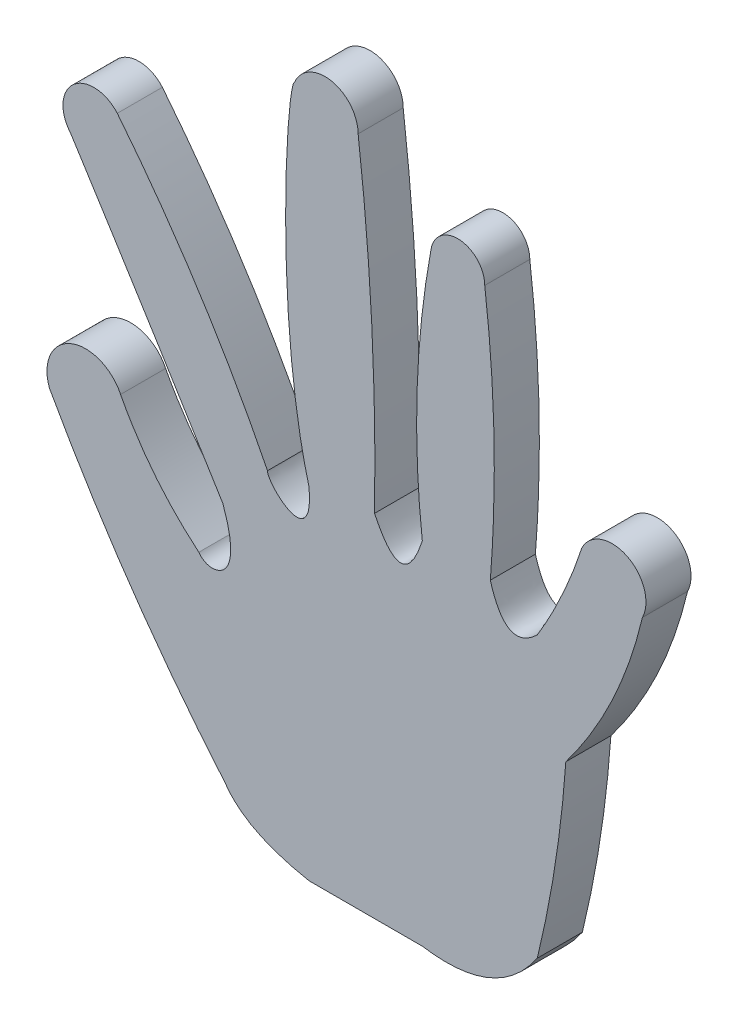
ISO-10303-21;
HEADER;
FILE_DESCRIPTION(('STEP AP214'),'2;1');
FILE_NAME('part.step','',(''),(''),'','','');
FILE_SCHEMA(('AUTOMOTIVE_DESIGN { 1 0 10303 214 1 1 1 1 }'));
ENDSEC;
DATA;
#1=APPLICATION_CONTEXT('core data for automotive mechanical design processes');
#2=APPLICATION_PROTOCOL_DEFINITION('international standard','automotive_design',2000,#1);
#3=PRODUCT_CONTEXT('',#1,'mechanical');
#4=PRODUCT('Part','Part','',(#3));
#5=PRODUCT_RELATED_PRODUCT_CATEGORY('part','',(#4));
#6=PRODUCT_DEFINITION_FORMATION('','',#4);
#7=PRODUCT_DEFINITION_CONTEXT('part definition',#1,'design');
#8=PRODUCT_DEFINITION('design','',#6,#7);
#9=PRODUCT_DEFINITION_SHAPE('','',#8);
#10=(LENGTH_UNIT() NAMED_UNIT(*) SI_UNIT(.MILLI.,.METRE.));
#11=(NAMED_UNIT(*) PLANE_ANGLE_UNIT() SI_UNIT($,.RADIAN.));
#12=(NAMED_UNIT(*) SI_UNIT($,.STERADIAN.) SOLID_ANGLE_UNIT());
#13=UNCERTAINTY_MEASURE_WITH_UNIT(LENGTH_MEASURE(1.E-05),#10,'distance_accuracy_value','');
#14=(GEOMETRIC_REPRESENTATION_CONTEXT(3) GLOBAL_UNCERTAINTY_ASSIGNED_CONTEXT((#13)) GLOBAL_UNIT_ASSIGNED_CONTEXT((#10,
#11,#12)) REPRESENTATION_CONTEXT('',''));
#15=CARTESIAN_POINT('',(0.,0.,0.));
#16=DIRECTION('',(0.,0.,1.));
#17=DIRECTION('',(1.,0.,0.));
#18=AXIS2_PLACEMENT_3D('',#15,#16,#17);
#19=CARTESIAN_POINT('',(2230.70337672121,-7786.81505543782,1000.));
#20=CARTESIAN_POINT('',(838.877081490708,-7523.15990356654,1000.));
#21=CARTESIAN_POINT('',(379.879561729541,-6850.52605220118,1000.));
#22=B_SPLINE_CURVE_WITH_KNOTS('',2,(#19,#20,#21),.UNSPECIFIED.,.F.,.F.,(3,3),(0.,1.),.UNSPECIFIED.);
#23=DIRECTION('',(0.,0.,-1.));
#24=VECTOR('',#23,1.);
#25=SURFACE_OF_LINEAR_EXTRUSION('',#22,#24);
#26=CARTESIAN_POINT('',(2230.70337672121,-7786.81505543782,0.));
#27=CARTESIAN_POINT('',(838.877081490708,-7523.15990356654,0.));
#28=CARTESIAN_POINT('',(379.879561729541,-6850.52605220118,0.));
#29=B_SPLINE_CURVE_WITH_KNOTS('',2,(#26,#27,#28),.UNSPECIFIED.,.F.,.F.,(3,3),(0.,1.),.UNSPECIFIED.);
#30=CARTESIAN_POINT('',(2230.70337672121,-7786.81505543782,0.));
#31=VERTEX_POINT('',#30);
#32=CARTESIAN_POINT('',(395.792572054723,-6873.32998539171,0.));
#33=VERTEX_POINT('',#32);
#34=EDGE_CURVE('E381',#31,#33,#29,.T.);
#35=ORIENTED_EDGE('',*,*,#34,.F.);
#36=DIRECTION('',(0.,0.,-1.));
#37=VECTOR('',#36,1.);
#38=CARTESIAN_POINT('',(2230.70337672121,-7786.81505543782,1000.));
#39=LINE('',#38,#37);
#40=CARTESIAN_POINT('',(2230.70337672121,-7786.81505543782,1000.));
#41=VERTEX_POINT('',#40);
#42=EDGE_CURVE('E11',#41,#31,#39,.T.);
#43=ORIENTED_EDGE('',*,*,#42,.F.);
#44=CARTESIAN_POINT('',(395.792572054723,-6873.32998539171,1000.));
#45=VERTEX_POINT('',#44);
#46=EDGE_CURVE('E543',#41,#45,#22,.T.);
#47=ORIENTED_EDGE('',*,*,#46,.T.);
#48=DIRECTION('',(0.,0.,-1.));
#49=VECTOR('',#48,1.);
#50=CARTESIAN_POINT('',(395.792572054723,-6873.32998539171,1000.));
#51=LINE('',#50,#49);
#52=EDGE_CURVE('E142',#45,#33,#51,.T.);
#53=ORIENTED_EDGE('',*,*,#52,.T.);
#54=EDGE_LOOP('',(#35,#43,#47,#53));
#55=FACE_BOUND('',#54,.T.);
#56=ADVANCED_FACE('F39',(#55),#25,.T.);
#57=CARTESIAN_POINT('',(0.,-7786.81505543782,1000.));
#58=DIRECTION('',(0.,1.,0.));
#59=DIRECTION('',(0.,0.,1.));
#60=AXIS2_PLACEMENT_3D('',#57,#58,#59);
#61=PLANE('',#60);
#62=DIRECTION('',(1.,0.,0.));
#63=VECTOR('',#62,1.);
#64=CARTESIAN_POINT('',(0.,-7786.81505543782,0.));
#65=LINE('',#64,#63);
#66=CARTESIAN_POINT('',(4743.05383111336,-7786.81505543782,0.));
#67=VERTEX_POINT('',#66);
#68=EDGE_CURVE('E376',#31,#67,#65,.T.);
#69=ORIENTED_EDGE('',*,*,#68,.T.);
#70=DIRECTION('',(0.,0.,-1.));
#71=VECTOR('',#70,1.);
#72=CARTESIAN_POINT('',(4743.05383111336,-7786.81505543782,1000.));
#73=LINE('',#72,#71);
#74=CARTESIAN_POINT('',(4743.05383111336,-7786.81505543782,1000.));
#75=VERTEX_POINT('',#74);
#76=EDGE_CURVE('E49',#75,#67,#73,.T.);
#77=ORIENTED_EDGE('',*,*,#76,.F.);
#78=DIRECTION('',(1.,0.,0.));
#79=VECTOR('',#78,1.);
#80=CARTESIAN_POINT('',(0.,-7786.81505543782,1000.));
#81=LINE('',#80,#79);
#82=EDGE_CURVE('E553',#41,#75,#81,.T.);
#83=ORIENTED_EDGE('',*,*,#82,.F.);
#84=ORIENTED_EDGE('',*,*,#42,.T.);
#85=EDGE_LOOP('',(#69,#77,#83,#84));
#86=FACE_BOUND('',#85,.T.);
#87=ADVANCED_FACE('F377',(#86),#61,.F.);
#88=CARTESIAN_POINT('',(7294.05771337584,-6741.7726687625,1000.));
#89=CARTESIAN_POINT('',(6406.51771806842,-8048.24499738228,1000.));
#90=CARTESIAN_POINT('',(4743.05383111336,-7786.81505543782,1000.));
#91=B_SPLINE_CURVE_WITH_KNOTS('',2,(#88,#89,#90),.UNSPECIFIED.,.F.,.F.,(3,3),(0.,1.),.UNSPECIFIED.);
#92=DIRECTION('',(0.,0.,-1.));
#93=VECTOR('',#92,1.);
#94=SURFACE_OF_LINEAR_EXTRUSION('',#91,#93);
#95=CARTESIAN_POINT('',(7294.05771337584,-6741.7726687625,0.));
#96=CARTESIAN_POINT('',(6406.51771806842,-8048.24499738228,0.));
#97=CARTESIAN_POINT('',(4743.05383111336,-7786.81505543782,0.));
#98=B_SPLINE_CURVE_WITH_KNOTS('',2,(#95,#96,#97),.UNSPECIFIED.,.F.,.F.,(3,3),(0.,1.),.UNSPECIFIED.);
#99=CARTESIAN_POINT('',(7294.05771337584,-6741.7726687625,0.));
#100=VERTEX_POINT('',#99);
#101=EDGE_CURVE('E370',#100,#67,#98,.T.);
#102=ORIENTED_EDGE('',*,*,#101,.F.);
#103=DIRECTION('',(0.,0.,-1.));
#104=VECTOR('',#103,1.);
#105=CARTESIAN_POINT('',(7294.05771337584,-6741.7726687625,1000.));
#106=LINE('',#105,#104);
#107=CARTESIAN_POINT('',(7294.05771337584,-6741.7726687625,1000.));
#108=VERTEX_POINT('',#107);
#109=EDGE_CURVE('E360',#108,#100,#106,.T.);
#110=ORIENTED_EDGE('',*,*,#109,.F.);
#111=EDGE_CURVE('E373',#108,#75,#91,.T.);
#112=ORIENTED_EDGE('',*,*,#111,.T.);
#113=ORIENTED_EDGE('',*,*,#76,.T.);
#114=EDGE_LOOP('',(#102,#110,#112,#113));
#115=FACE_BOUND('',#114,.T.);
#116=ADVANCED_FACE('F368',(#115),#94,.T.);
#117=CARTESIAN_POINT('',(7926.4035184112,-2651.00344321377,1000.));
#118=CARTESIAN_POINT('',(7782.90997558239,-4725.08830100852,1000.));
#119=CARTESIAN_POINT('',(7294.05771337584,-6741.7726687625,1000.));
#120=B_SPLINE_CURVE_WITH_KNOTS('',2,(#117,#118,#119),.UNSPECIFIED.,.F.,.F.,(3,3),(0.,1.),.UNSPECIFIED.);
#121=DIRECTION('',(0.,0.,-1.));
#122=VECTOR('',#121,1.);
#123=SURFACE_OF_LINEAR_EXTRUSION('',#120,#122);
#124=CARTESIAN_POINT('',(7926.4035184112,-2651.00344321377,0.));
#125=CARTESIAN_POINT('',(7782.90997558239,-4725.08830100852,0.));
#126=CARTESIAN_POINT('',(7294.05771337584,-6741.7726687625,0.));
#127=B_SPLINE_CURVE_WITH_KNOTS('',2,(#124,#125,#126),.UNSPECIFIED.,.F.,.F.,(3,3),(0.,1.),.UNSPECIFIED.);
#128=CARTESIAN_POINT('',(7926.4035184112,-2651.00344321377,0.));
#129=VERTEX_POINT('',#128);
#130=EDGE_CURVE('E386',#129,#100,#127,.T.);
#131=ORIENTED_EDGE('',*,*,#130,.F.);
#132=DIRECTION('',(0.,0.,-1.));
#133=VECTOR('',#132,1.);
#134=CARTESIAN_POINT('',(7926.4035184112,-2651.00344321377,1000.));
#135=LINE('',#134,#133);
#136=CARTESIAN_POINT('',(7926.4035184112,-2651.00344321377,1000.));
#137=VERTEX_POINT('',#136);
#138=EDGE_CURVE('E357',#137,#129,#135,.T.);
#139=ORIENTED_EDGE('',*,*,#138,.F.);
#140=EDGE_CURVE('E568',#137,#108,#120,.T.);
#141=ORIENTED_EDGE('',*,*,#140,.T.);
#142=ORIENTED_EDGE('',*,*,#109,.T.);
#143=EDGE_LOOP('',(#131,#139,#141,#142));
#144=FACE_BOUND('',#143,.T.);
#145=ADVANCED_FACE('F579',(#144),#123,.T.);
#146=CARTESIAN_POINT('',(9626.32112904252,970.777177927694,1000.));
#147=CARTESIAN_POINT('',(9151.24781503962,-1031.31597078158,1000.));
#148=CARTESIAN_POINT('',(7926.4035184112,-2651.00344321377,1000.));
#149=B_SPLINE_CURVE_WITH_KNOTS('',2,(#146,#147,#148),.UNSPECIFIED.,.F.,.F.,(3,3),(0.,1.),.UNSPECIFIED.);
#150=DIRECTION('',(0.,0.,-1.));
#151=VECTOR('',#150,1.);
#152=SURFACE_OF_LINEAR_EXTRUSION('',#149,#151);
#153=CARTESIAN_POINT('',(9626.32112904252,970.777177927694,0.));
#154=CARTESIAN_POINT('',(9151.24781503962,-1031.31597078158,0.));
#155=CARTESIAN_POINT('',(7926.4035184112,-2651.00344321377,0.));
#156=B_SPLINE_CURVE_WITH_KNOTS('',2,(#153,#154,#155),.UNSPECIFIED.,.F.,.F.,(3,3),(0.,1.),.UNSPECIFIED.);
#157=CARTESIAN_POINT('',(9626.32112904252,970.777177927694,0.));
#158=VERTEX_POINT('',#157);
#159=EDGE_CURVE('E390',#158,#129,#156,.T.);
#160=ORIENTED_EDGE('',*,*,#159,.F.);
#161=DIRECTION('',(0.,0.,-1.));
#162=VECTOR('',#161,1.);
#163=CARTESIAN_POINT('',(9626.32112904252,970.777177927694,1000.));
#164=LINE('',#163,#162);
#165=CARTESIAN_POINT('',(9626.32112904252,970.777177927694,1000.));
#166=VERTEX_POINT('',#165);
#167=EDGE_CURVE('E354',#166,#158,#164,.T.);
#168=ORIENTED_EDGE('',*,*,#167,.F.);
#169=EDGE_CURVE('E860',#166,#137,#149,.T.);
#170=ORIENTED_EDGE('',*,*,#169,.T.);
#171=ORIENTED_EDGE('',*,*,#138,.T.);
#172=EDGE_LOOP('',(#160,#168,#170,#171));
#173=FACE_BOUND('',#172,.T.);
#174=ADVANCED_FACE('F606',(#173),#152,.T.);
#175=CARTESIAN_POINT('',(8954.80678660998,1304.79587187668,1000.));
#176=DIRECTION('',(0.,0.,-1.));
#177=DIRECTION('',(-1.,0.,0.));
#178=AXIS2_PLACEMENT_3D('',#175,#176,#177);
#179=CYLINDRICAL_SURFACE('',#178,750.);
#180=CARTESIAN_POINT('',(8954.80678660998,1304.79587187668,0.));
#181=DIRECTION('',(0.,0.,1.));
#182=DIRECTION('',(1.,0.,0.));
#183=AXIS2_PLACEMENT_3D('',#180,#181,#182);
#184=CIRCLE('',#183,750.);
#185=CARTESIAN_POINT('',(8283.29244417744,1638.81456582568,0.));
#186=VERTEX_POINT('',#185);
#187=EDGE_CURVE('E407',#186,#158,#184,.F.);
#188=ORIENTED_EDGE('',*,*,#187,.F.);
#189=DIRECTION('',(0.,0.,-1.));
#190=VECTOR('',#189,1.);
#191=CARTESIAN_POINT('',(8283.29244417744,1638.81456582568,1000.));
#192=LINE('',#191,#190);
#193=CARTESIAN_POINT('',(8283.29244417744,1638.81456582568,1000.));
#194=VERTEX_POINT('',#193);
#195=EDGE_CURVE('E351',#194,#186,#192,.T.);
#196=ORIENTED_EDGE('',*,*,#195,.F.);
#197=CARTESIAN_POINT('',(8954.80678660998,1304.79587187668,1000.));
#198=DIRECTION('',(0.,0.,1.));
#199=DIRECTION('',(1.,0.,0.));
#200=AXIS2_PLACEMENT_3D('',#197,#198,#199);
#201=CIRCLE('',#200,750.);
#202=EDGE_CURVE('E857',#194,#166,#201,.F.);
#203=ORIENTED_EDGE('',*,*,#202,.T.);
#204=ORIENTED_EDGE('',*,*,#167,.T.);
#205=EDGE_LOOP('',(#188,#196,#203,#204));
#206=FACE_BOUND('',#205,.T.);
#207=ADVANCED_FACE('F615',(#206),#179,.T.);
#208=CARTESIAN_POINT('',(8283.29244417744,1638.81456582568,1000.));
#209=CARTESIAN_POINT('',(7913.68165515547,496.999655054849,1000.));
#210=CARTESIAN_POINT('',(7292.14911922608,-532.552706312509,1000.));
#211=B_SPLINE_CURVE_WITH_KNOTS('',2,(#208,#209,#210),.UNSPECIFIED.,.F.,.F.,(3,3),(0.,1.),.UNSPECIFIED.);
#212=DIRECTION('',(0.,0.,-1.));
#213=VECTOR('',#212,1.);
#214=SURFACE_OF_LINEAR_EXTRUSION('',#211,#213);
#215=CARTESIAN_POINT('',(8283.29244417744,1638.81456582568,0.));
#216=CARTESIAN_POINT('',(7913.68165515547,496.999655054849,0.));
#217=CARTESIAN_POINT('',(7292.14911922608,-532.552706312509,0.));
#218=B_SPLINE_CURVE_WITH_KNOTS('',2,(#215,#216,#217),.UNSPECIFIED.,.F.,.F.,(3,3),(0.,1.),.UNSPECIFIED.);
#219=CARTESIAN_POINT('',(7292.14911922608,-532.552706312509,0.));
#220=VERTEX_POINT('',#219);
#221=EDGE_CURVE('E414',#186,#220,#218,.T.);
#222=ORIENTED_EDGE('',*,*,#221,.T.);
#223=DIRECTION('',(0.,0.,-1.));
#224=VECTOR('',#223,1.);
#225=CARTESIAN_POINT('',(7292.14911922608,-532.552706312509,1000.));
#226=LINE('',#225,#224);
#227=CARTESIAN_POINT('',(7292.14911922608,-532.552706312509,1000.));
#228=VERTEX_POINT('',#227);
#229=EDGE_CURVE('E347',#228,#220,#226,.T.);
#230=ORIENTED_EDGE('',*,*,#229,.F.);
#231=EDGE_CURVE('E852',#194,#228,#211,.T.);
#232=ORIENTED_EDGE('',*,*,#231,.F.);
#233=ORIENTED_EDGE('',*,*,#195,.T.);
#234=EDGE_LOOP('',(#222,#230,#232,#233));
#235=FACE_BOUND('',#234,.T.);
#236=ADVANCED_FACE('F624',(#235),#214,.F.);
#237=CARTESIAN_POINT('',(7292.14911922608,-532.552706312509,1000.));
#238=CARTESIAN_POINT('',(6599.09596299458,-1196.63110017982,1000.));
#239=CARTESIAN_POINT('',(6251.69457875293,0.,1000.));
#240=B_SPLINE_CURVE_WITH_KNOTS('',2,(#237,#238,#239),.UNSPECIFIED.,.F.,.F.,(3,3),(0.,1.),.UNSPECIFIED.);
#241=DIRECTION('',(0.,0.,-1.));
#242=VECTOR('',#241,1.);
#243=SURFACE_OF_LINEAR_EXTRUSION('',#240,#242);
#244=CARTESIAN_POINT('',(7292.14911922608,-532.552706312509,0.));
#245=CARTESIAN_POINT('',(6599.09596299458,-1196.63110017982,0.));
#246=CARTESIAN_POINT('',(6251.69457875293,0.,0.));
#247=B_SPLINE_CURVE_WITH_KNOTS('',2,(#244,#245,#246),.UNSPECIFIED.,.F.,.F.,(3,3),(0.,1.),.UNSPECIFIED.);
#248=CARTESIAN_POINT('',(6251.69457875293,0.,0.));
#249=VERTEX_POINT('',#248);
#250=EDGE_CURVE('E419',#220,#249,#247,.T.);
#251=ORIENTED_EDGE('',*,*,#250,.T.);
#252=DIRECTION('',(0.,0.,-1.));
#253=VECTOR('',#252,1.);
#254=CARTESIAN_POINT('',(6251.69457875293,0.,1000.));
#255=LINE('',#254,#253);
#256=CARTESIAN_POINT('',(6251.69457875293,0.,1000.));
#257=VERTEX_POINT('',#256);
#258=EDGE_CURVE('E344',#257,#249,#255,.T.);
#259=ORIENTED_EDGE('',*,*,#258,.F.);
#260=EDGE_CURVE('E850',#228,#257,#240,.T.);
#261=ORIENTED_EDGE('',*,*,#260,.F.);
#262=ORIENTED_EDGE('',*,*,#229,.T.);
#263=EDGE_LOOP('',(#251,#259,#261,#262));
#264=FACE_BOUND('',#263,.T.);
#265=ADVANCED_FACE('F634',(#264),#243,.F.);
#266=CARTESIAN_POINT('',(6128.01678462207,5601.93212093995,1000.));
#267=CARTESIAN_POINT('',(6476.13026446697,2805.12446597355,1000.));
#268=CARTESIAN_POINT('',(6251.69457875293,0.,1000.));
#269=B_SPLINE_CURVE_WITH_KNOTS('',2,(#266,#267,#268),.UNSPECIFIED.,.F.,.F.,(3,3),(0.,1.),.UNSPECIFIED.);
#270=DIRECTION('',(0.,0.,-1.));
#271=VECTOR('',#270,1.);
#272=SURFACE_OF_LINEAR_EXTRUSION('',#269,#271);
#273=CARTESIAN_POINT('',(6128.01678462207,5601.93212093995,0.));
#274=CARTESIAN_POINT('',(6476.13026446697,2805.12446597355,0.));
#275=CARTESIAN_POINT('',(6251.69457875293,0.,0.));
#276=B_SPLINE_CURVE_WITH_KNOTS('',2,(#273,#274,#275),.UNSPECIFIED.,.F.,.F.,(3,3),(0.,1.),.UNSPECIFIED.);
#277=CARTESIAN_POINT('',(6128.01678462207,5601.93212093995,0.));
#278=VERTEX_POINT('',#277);
#279=EDGE_CURVE('E428',#278,#249,#276,.T.);
#280=ORIENTED_EDGE('',*,*,#279,.F.);
#281=DIRECTION('',(0.,0.,-1.));
#282=VECTOR('',#281,1.);
#283=CARTESIAN_POINT('',(6128.01678462207,5601.93212093995,1000.));
#284=LINE('',#283,#282);
#285=CARTESIAN_POINT('',(6128.01678462207,5601.93212093995,1000.));
#286=VERTEX_POINT('',#285);
#287=EDGE_CURVE('E341',#286,#278,#284,.T.);
#288=ORIENTED_EDGE('',*,*,#287,.F.);
#289=EDGE_CURVE('E847',#286,#257,#269,.T.);
#290=ORIENTED_EDGE('',*,*,#289,.T.);
#291=ORIENTED_EDGE('',*,*,#258,.T.);
#292=EDGE_LOOP('',(#280,#288,#290,#291));
#293=FACE_BOUND('',#292,.T.);
#294=ADVANCED_FACE('F644',(#293),#272,.T.);
#295=CARTESIAN_POINT('',(5528.01678462207,5601.93212093995,1000.));
#296=DIRECTION('',(0.,0.,-1.));
#297=DIRECTION('',(-1.,0.,0.));
#298=AXIS2_PLACEMENT_3D('',#295,#296,#297);
#299=CYLINDRICAL_SURFACE('',#298,599.999999999999);
#300=CARTESIAN_POINT('',(5528.01678462207,5601.93212093995,0.));
#301=DIRECTION('',(0.,0.,1.));
#302=DIRECTION('',(1.,0.,0.));
#303=AXIS2_PLACEMENT_3D('',#300,#301,#302);
#304=CIRCLE('',#303,599.999999999999);
#305=CARTESIAN_POINT('',(4937.60330274844,5708.75871136504,0.));
#306=VERTEX_POINT('',#305);
#307=EDGE_CURVE('E437',#306,#278,#304,.F.);
#308=ORIENTED_EDGE('',*,*,#307,.F.);
#309=DIRECTION('',(0.,0.,-1.));
#310=VECTOR('',#309,1.);
#311=CARTESIAN_POINT('',(4937.60330274844,5708.75871136504,1000.));
#312=LINE('',#311,#310);
#313=CARTESIAN_POINT('',(4937.60330274844,5708.75871136504,1000.));
#314=VERTEX_POINT('',#313);
#315=EDGE_CURVE('E338',#314,#306,#312,.T.);
#316=ORIENTED_EDGE('',*,*,#315,.F.);
#317=CARTESIAN_POINT('',(5528.01678462207,5601.93212093995,1000.));
#318=DIRECTION('',(0.,0.,1.));
#319=DIRECTION('',(1.,0.,0.));
#320=AXIS2_PLACEMENT_3D('',#317,#318,#319);
#321=CIRCLE('',#320,599.999999999999);
#322=EDGE_CURVE('E840',#314,#286,#321,.F.);
#323=ORIENTED_EDGE('',*,*,#322,.T.);
#324=ORIENTED_EDGE('',*,*,#287,.T.);
#325=EDGE_LOOP('',(#308,#316,#323,#324));
#326=FACE_BOUND('',#325,.T.);
#327=ADVANCED_FACE('F654',(#326),#299,.T.);
#328=CARTESIAN_POINT('',(4937.60330274844,5708.75871136504,1000.));
#329=CARTESIAN_POINT('',(4413.95196285708,2863.66684989428,1000.));
#330=CARTESIAN_POINT('',(4743.05383111336,0.,1000.));
#331=B_SPLINE_CURVE_WITH_KNOTS('',2,(#328,#329,#330),.UNSPECIFIED.,.F.,.F.,(3,3),(0.,1.),.UNSPECIFIED.);
#332=DIRECTION('',(0.,0.,-1.));
#333=VECTOR('',#332,1.);
#334=SURFACE_OF_LINEAR_EXTRUSION('',#331,#333);
#335=CARTESIAN_POINT('',(4937.60330274844,5708.75871136504,0.));
#336=CARTESIAN_POINT('',(4413.95196285708,2863.66684989428,0.));
#337=CARTESIAN_POINT('',(4743.05383111336,0.,0.));
#338=B_SPLINE_CURVE_WITH_KNOTS('',2,(#335,#336,#337),.UNSPECIFIED.,.F.,.F.,(3,3),(0.,1.),.UNSPECIFIED.);
#339=CARTESIAN_POINT('',(4743.05383111336,0.,0.));
#340=VERTEX_POINT('',#339);
#341=EDGE_CURVE('E444',#306,#340,#338,.T.);
#342=ORIENTED_EDGE('',*,*,#341,.T.);
#343=DIRECTION('',(0.,0.,-1.));
#344=VECTOR('',#343,1.);
#345=CARTESIAN_POINT('',(4743.05383111336,0.,1000.));
#346=LINE('',#345,#344);
#347=CARTESIAN_POINT('',(4743.05383111336,0.,1000.));
#348=VERTEX_POINT('',#347);
#349=EDGE_CURVE('E334',#348,#340,#346,.T.);
#350=ORIENTED_EDGE('',*,*,#349,.F.);
#351=EDGE_CURVE('E837',#314,#348,#331,.T.);
#352=ORIENTED_EDGE('',*,*,#351,.F.);
#353=ORIENTED_EDGE('',*,*,#315,.T.);
#354=EDGE_LOOP('',(#342,#350,#352,#353));
#355=FACE_BOUND('',#354,.T.);
#356=ADVANCED_FACE('F664',(#355),#334,.F.);
#357=CARTESIAN_POINT('',(4743.05383111336,0.,1000.));
#358=CARTESIAN_POINT('',(4312.77905391653,-1324.82138324762,1000.));
#359=CARTESIAN_POINT('',(3682.74997724114,0.,1000.));
#360=B_SPLINE_CURVE_WITH_KNOTS('',2,(#357,#358,#359),.UNSPECIFIED.,.F.,.F.,(3,3),(0.,1.),.UNSPECIFIED.);
#361=DIRECTION('',(0.,0.,-1.));
#362=VECTOR('',#361,1.);
#363=SURFACE_OF_LINEAR_EXTRUSION('',#360,#362);
#364=CARTESIAN_POINT('',(4743.05383111336,0.,0.));
#365=CARTESIAN_POINT('',(4312.77905391653,-1324.82138324762,0.));
#366=CARTESIAN_POINT('',(3682.74997724114,0.,0.));
#367=B_SPLINE_CURVE_WITH_KNOTS('',2,(#364,#365,#366),.UNSPECIFIED.,.F.,.F.,(3,3),(0.,1.),.UNSPECIFIED.);
#368=CARTESIAN_POINT('',(3682.74997724114,0.,0.));
#369=VERTEX_POINT('',#368);
#370=EDGE_CURVE('E449',#340,#369,#367,.T.);
#371=ORIENTED_EDGE('',*,*,#370,.T.);
#372=DIRECTION('',(0.,0.,-1.));
#373=VECTOR('',#372,1.);
#374=CARTESIAN_POINT('',(3682.74997724114,0.,1000.));
#375=LINE('',#374,#373);
#376=CARTESIAN_POINT('',(3682.74997724114,0.,1000.));
#377=VERTEX_POINT('',#376);
#378=EDGE_CURVE('E331',#377,#369,#375,.T.);
#379=ORIENTED_EDGE('',*,*,#378,.F.);
#380=EDGE_CURVE('E835',#348,#377,#360,.T.);
#381=ORIENTED_EDGE('',*,*,#380,.F.);
#382=ORIENTED_EDGE('',*,*,#349,.T.);
#383=EDGE_LOOP('',(#371,#379,#381,#382));
#384=FACE_BOUND('',#383,.T.);
#385=ADVANCED_FACE('F674',(#384),#363,.F.);
#386=CARTESIAN_POINT('',(3318.77751625231,7110.10034162406,1000.));
#387=CARTESIAN_POINT('',(3746.25125002393,3568.22439272406,1000.));
#388=CARTESIAN_POINT('',(3682.74997724114,0.,1000.));
#389=B_SPLINE_CURVE_WITH_KNOTS('',2,(#386,#387,#388),.UNSPECIFIED.,.F.,.F.,(3,3),(0.,1.),.UNSPECIFIED.);
#390=DIRECTION('',(0.,0.,-1.));
#391=VECTOR('',#390,1.);
#392=SURFACE_OF_LINEAR_EXTRUSION('',#389,#391);
#393=CARTESIAN_POINT('',(3318.77751625231,7110.10034162406,0.));
#394=CARTESIAN_POINT('',(3746.25125002393,3568.22439272406,0.));
#395=CARTESIAN_POINT('',(3682.74997724114,0.,0.));
#396=B_SPLINE_CURVE_WITH_KNOTS('',2,(#393,#394,#395),.UNSPECIFIED.,.F.,.F.,(3,3),(0.,1.),.UNSPECIFIED.);
#397=CARTESIAN_POINT('',(3318.77751625231,7110.10034162406,0.));
#398=VERTEX_POINT('',#397);
#399=EDGE_CURVE('E458',#398,#369,#396,.T.);
#400=ORIENTED_EDGE('',*,*,#399,.F.);
#401=DIRECTION('',(0.,0.,-1.));
#402=VECTOR('',#401,1.);
#403=CARTESIAN_POINT('',(3318.77751625231,7110.10034162406,1000.));
#404=LINE('',#403,#402);
#405=CARTESIAN_POINT('',(3318.77751625231,7110.10034162406,1000.));
#406=VERTEX_POINT('',#405);
#407=EDGE_CURVE('E328',#406,#398,#404,.T.);
#408=ORIENTED_EDGE('',*,*,#407,.F.);
#409=EDGE_CURVE('E912',#406,#377,#389,.T.);
#410=ORIENTED_EDGE('',*,*,#409,.T.);
#411=ORIENTED_EDGE('',*,*,#378,.T.);
#412=EDGE_LOOP('',(#400,#408,#410,#411));
#413=FACE_BOUND('',#412,.T.);
#414=ADVANCED_FACE('F684',(#413),#392,.T.);
#415=CARTESIAN_POINT('',(2583.66504851062,7109.3166635937,1000.));
#416=DIRECTION('',(0.,0.,-1.));
#417=DIRECTION('',(-1.,0.,0.));
#418=AXIS2_PLACEMENT_3D('',#415,#416,#417);
#419=CYLINDRICAL_SURFACE('',#418,735.112885467627);
#420=CARTESIAN_POINT('',(2583.66504851062,7109.3166635937,0.));
#421=DIRECTION('',(0.,0.,1.));
#422=DIRECTION('',(1.,0.,0.));
#423=AXIS2_PLACEMENT_3D('',#420,#421,#422);
#424=CIRCLE('',#423,735.112885467627);
#425=CARTESIAN_POINT('',(1907.67477252594,7398.15589423024,0.));
#426=VERTEX_POINT('',#425);
#427=EDGE_CURVE('E467',#426,#398,#424,.F.);
#428=ORIENTED_EDGE('',*,*,#427,.F.);
#429=DIRECTION('',(0.,0.,-1.));
#430=VECTOR('',#429,1.);
#431=CARTESIAN_POINT('',(1907.67477252594,7398.15589423024,1000.));
#432=LINE('',#431,#430);
#433=CARTESIAN_POINT('',(1907.67477252594,7398.15589423024,1000.));
#434=VERTEX_POINT('',#433);
#435=EDGE_CURVE('E325',#434,#426,#432,.T.);
#436=ORIENTED_EDGE('',*,*,#435,.F.);
#437=CARTESIAN_POINT('',(2583.66504851062,7109.3166635937,1000.));
#438=DIRECTION('',(0.,0.,1.));
#439=DIRECTION('',(1.,0.,0.));
#440=AXIS2_PLACEMENT_3D('',#437,#438,#439);
#441=CIRCLE('',#440,735.112885467627);
#442=EDGE_CURVE('E826',#434,#406,#441,.F.);
#443=ORIENTED_EDGE('',*,*,#442,.T.);
#444=ORIENTED_EDGE('',*,*,#407,.T.);
#445=EDGE_LOOP('',(#428,#436,#443,#444));
#446=FACE_BOUND('',#445,.T.);
#447=ADVANCED_FACE('F694',(#446),#419,.T.);
#448=CARTESIAN_POINT('',(1907.67477252594,7398.15589423024,1000.));
#449=CARTESIAN_POINT('',(1727.37428110436,7282.69972686104,1000.));
#450=CARTESIAN_POINT('',(1453.82223485005,2643.68320905191,1000.));
#451=CARTESIAN_POINT('',(2230.70337672121,-225.221152688645,1000.));
#452=B_SPLINE_CURVE_WITH_KNOTS('',3,(#448,#449,#450,#451),.UNSPECIFIED.,.F.,.F.,(4,4),(0.,1.),.UNSPECIFIED.);
#453=DIRECTION('',(0.,0.,-1.));
#454=VECTOR('',#453,1.);
#455=SURFACE_OF_LINEAR_EXTRUSION('',#452,#454);
#456=CARTESIAN_POINT('',(1907.67477252594,7398.15589423024,0.));
#457=CARTESIAN_POINT('',(1727.37428110436,7282.69972686104,0.));
#458=CARTESIAN_POINT('',(1453.82223485005,2643.68320905191,0.));
#459=CARTESIAN_POINT('',(2230.70337672121,-225.221152688645,0.));
#460=B_SPLINE_CURVE_WITH_KNOTS('',3,(#456,#457,#458,#459),.UNSPECIFIED.,.F.,.F.,(4,4),(0.,1.),.UNSPECIFIED.);
#461=CARTESIAN_POINT('',(2230.70337672121,-225.221152688643,0.));
#462=VERTEX_POINT('',#461);
#463=EDGE_CURVE('E474',#426,#462,#460,.T.);
#464=ORIENTED_EDGE('',*,*,#463,.T.);
#465=DIRECTION('',(0.,0.,-1.));
#466=VECTOR('',#465,1.);
#467=CARTESIAN_POINT('',(2230.70337672121,-225.221152688643,1000.));
#468=LINE('',#467,#466);
#469=CARTESIAN_POINT('',(2230.70337672121,-225.221152688643,1000.));
#470=VERTEX_POINT('',#469);
#471=EDGE_CURVE('E321',#470,#462,#468,.T.);
#472=ORIENTED_EDGE('',*,*,#471,.F.);
#473=EDGE_CURVE('E926',#434,#470,#452,.T.);
#474=ORIENTED_EDGE('',*,*,#473,.F.);
#475=ORIENTED_EDGE('',*,*,#435,.T.);
#476=EDGE_LOOP('',(#464,#472,#474,#475));
#477=FACE_BOUND('',#476,.T.);
#478=ADVANCED_FACE('F704',(#477),#455,.F.);
#479=CARTESIAN_POINT('',(2230.70337672121,-225.221152688643,1000.));
#480=CARTESIAN_POINT('',(2353.62386516501,-1570.04707711999,1000.));
#481=CARTESIAN_POINT('',(1307.53559058434,-636.844625667615,1000.));
#482=CARTESIAN_POINT('',(1307.89440360537,-368.141611349606,1000.));
#483=B_SPLINE_CURVE_WITH_KNOTS('',3,(#479,#480,#481,#482),.UNSPECIFIED.,.F.,.F.,(4,4),(0.,1.),.UNSPECIFIED.);
#484=DIRECTION('',(0.,0.,-1.));
#485=VECTOR('',#484,1.);
#486=SURFACE_OF_LINEAR_EXTRUSION('',#483,#485);
#487=CARTESIAN_POINT('',(2230.70337672121,-225.221152688643,0.));
#488=CARTESIAN_POINT('',(2353.62386516501,-1570.04707711999,0.));
#489=CARTESIAN_POINT('',(1307.53559058434,-636.844625667615,0.));
#490=CARTESIAN_POINT('',(1307.89440360537,-368.141611349606,0.));
#491=B_SPLINE_CURVE_WITH_KNOTS('',3,(#487,#488,#489,#490),.UNSPECIFIED.,.F.,.F.,(4,4),(0.,1.),.UNSPECIFIED.);
#492=CARTESIAN_POINT('',(1307.89440360537,-368.141611349606,0.));
#493=VERTEX_POINT('',#492);
#494=EDGE_CURVE('E479',#462,#493,#491,.T.);
#495=ORIENTED_EDGE('',*,*,#494,.T.);
#496=DIRECTION('',(0.,0.,-1.));
#497=VECTOR('',#496,1.);
#498=CARTESIAN_POINT('',(1307.89440360537,-368.141611349606,1000.));
#499=LINE('',#498,#497);
#500=CARTESIAN_POINT('',(1307.89440360537,-368.141611349606,1000.));
#501=VERTEX_POINT('',#500);
#502=EDGE_CURVE('E317',#501,#493,#499,.T.);
#503=ORIENTED_EDGE('',*,*,#502,.F.);
#504=EDGE_CURVE('E818',#470,#501,#483,.T.);
#505=ORIENTED_EDGE('',*,*,#504,.F.);
#506=ORIENTED_EDGE('',*,*,#471,.T.);
#507=EDGE_LOOP('',(#495,#503,#505,#506));
#508=FACE_BOUND('',#507,.T.);
#509=ADVANCED_FACE('F714',(#508),#486,.F.);
#510=CARTESIAN_POINT('',(1307.89440360537,-368.141611349607,1000.));
#511=CARTESIAN_POINT('',(-82.1473772154885,2408.69363839597,1000.));
#512=CARTESIAN_POINT('',(-2024.33450747947,4833.61161638246,1000.));
#513=B_SPLINE_CURVE_WITH_KNOTS('',2,(#510,#511,#512),.UNSPECIFIED.,.F.,.F.,(3,3),(0.,1.),.UNSPECIFIED.);
#514=DIRECTION('',(0.,0.,-1.));
#515=VECTOR('',#514,1.);
#516=SURFACE_OF_LINEAR_EXTRUSION('',#513,#515);
#517=CARTESIAN_POINT('',(1307.89440360537,-368.141611349607,0.));
#518=CARTESIAN_POINT('',(-82.1473772154885,2408.69363839597,0.));
#519=CARTESIAN_POINT('',(-2024.33450747947,4833.61161638246,0.));
#520=B_SPLINE_CURVE_WITH_KNOTS('',2,(#517,#518,#519),.UNSPECIFIED.,.F.,.F.,(3,3),(0.,1.),.UNSPECIFIED.);
#521=CARTESIAN_POINT('',(-2024.33450747947,4833.61161638246,0.));
#522=VERTEX_POINT('',#521);
#523=EDGE_CURVE('E487',#493,#522,#520,.T.);
#524=ORIENTED_EDGE('',*,*,#523,.T.);
#525=DIRECTION('',(0.,0.,-1.));
#526=VECTOR('',#525,1.);
#527=CARTESIAN_POINT('',(-2024.33450747947,4833.61161638246,1000.));
#528=LINE('',#527,#526);
#529=CARTESIAN_POINT('',(-2024.33450747947,4833.61161638246,1000.));
#530=VERTEX_POINT('',#529);
#531=EDGE_CURVE('E314',#530,#522,#528,.T.);
#532=ORIENTED_EDGE('',*,*,#531,.F.);
#533=EDGE_CURVE('E816',#501,#530,#513,.T.);
#534=ORIENTED_EDGE('',*,*,#533,.F.);
#535=ORIENTED_EDGE('',*,*,#502,.T.);
#536=EDGE_LOOP('',(#524,#532,#534,#535));
#537=FACE_BOUND('',#536,.T.);
#538=ADVANCED_FACE('F724',(#537),#516,.F.);
#539=CARTESIAN_POINT('',(-2543.72448605103,4385.17616052822,1000.));
#540=DIRECTION('',(0.,0.,-1.));
#541=DIRECTION('',(-1.,0.,0.));
#542=AXIS2_PLACEMENT_3D('',#539,#540,#541);
#543=CYLINDRICAL_SURFACE('',#542,686.192617205813);
#544=CARTESIAN_POINT('',(-2543.72448605103,4385.17616052822,0.));
#545=DIRECTION('',(0.,0.,1.));
#546=DIRECTION('',(1.,0.,0.));
#547=AXIS2_PLACEMENT_3D('',#544,#545,#546);
#548=CIRCLE('',#547,686.192617205813);
#549=CARTESIAN_POINT('',(-3063.11446462259,3936.74070467398,0.));
#550=VERTEX_POINT('',#549);
#551=EDGE_CURVE('E496',#550,#522,#548,.F.);
#552=ORIENTED_EDGE('',*,*,#551,.F.);
#553=DIRECTION('',(0.,0.,-1.));
#554=VECTOR('',#553,1.);
#555=CARTESIAN_POINT('',(-3063.11446462259,3936.74070467398,1000.));
#556=LINE('',#555,#554);
#557=CARTESIAN_POINT('',(-3063.11446462259,3936.74070467398,1000.));
#558=VERTEX_POINT('',#557);
#559=EDGE_CURVE('E307',#558,#550,#556,.T.);
#560=ORIENTED_EDGE('',*,*,#559,.F.);
#561=CARTESIAN_POINT('',(-2543.72448605103,4385.17616052822,1000.));
#562=DIRECTION('',(0.,0.,1.));
#563=DIRECTION('',(1.,0.,0.));
#564=AXIS2_PLACEMENT_3D('',#561,#562,#563);
#565=CIRCLE('',#564,686.192617205813);
#566=EDGE_CURVE('E813',#558,#530,#565,.F.);
#567=ORIENTED_EDGE('',*,*,#566,.T.);
#568=ORIENTED_EDGE('',*,*,#531,.T.);
#569=EDGE_LOOP('',(#552,#560,#567,#568));
#570=FACE_BOUND('',#569,.T.);
#571=ADVANCED_FACE('F734',(#570),#543,.T.);
#572=CARTESIAN_POINT('',(316.998012386101,-1491.06807375231,1000.));
#573=CARTESIAN_POINT('',(-1349.21668881704,1237.7013227702,1000.));
#574=CARTESIAN_POINT('',(-3063.11446462259,3936.74070467398,1000.));
#575=B_SPLINE_CURVE_WITH_KNOTS('',2,(#572,#573,#574),.UNSPECIFIED.,.F.,.F.,(3,3),(0.,1.),.UNSPECIFIED.);
#576=DIRECTION('',(0.,0.,-1.));
#577=VECTOR('',#576,1.);
#578=SURFACE_OF_LINEAR_EXTRUSION('',#575,#577);
#579=CARTESIAN_POINT('',(316.998012386101,-1491.06807375231,0.));
#580=CARTESIAN_POINT('',(-1349.21668881704,1237.7013227702,0.));
#581=CARTESIAN_POINT('',(-3063.11446462259,3936.74070467398,0.));
#582=B_SPLINE_CURVE_WITH_KNOTS('',2,(#579,#580,#581),.UNSPECIFIED.,.F.,.F.,(3,3),(0.,1.),.UNSPECIFIED.);
#583=CARTESIAN_POINT('',(316.998012386101,-1491.06807375231,0.));
#584=VERTEX_POINT('',#583);
#585=EDGE_CURVE('E503',#584,#550,#582,.T.);
#586=ORIENTED_EDGE('',*,*,#585,.F.);
#587=DIRECTION('',(0.,0.,-1.));
#588=VECTOR('',#587,1.);
#589=CARTESIAN_POINT('',(316.998012386101,-1491.06807375231,1000.));
#590=LINE('',#589,#588);
#591=CARTESIAN_POINT('',(316.998012386101,-1491.06807375231,1000.));
#592=VERTEX_POINT('',#591);
#593=EDGE_CURVE('E303',#592,#584,#590,.T.);
#594=ORIENTED_EDGE('',*,*,#593,.F.);
#595=EDGE_CURVE('E280',#592,#558,#575,.T.);
#596=ORIENTED_EDGE('',*,*,#595,.T.);
#597=ORIENTED_EDGE('',*,*,#559,.T.);
#598=EDGE_LOOP('',(#586,#594,#596,#597));
#599=FACE_BOUND('',#598,.T.);
#600=ADVANCED_FACE('F271',(#599),#578,.T.);
#601=CARTESIAN_POINT('',(316.998012386101,-1491.06807375231,1000.));
#602=CARTESIAN_POINT('',(625.968743176425,-2340.71628822971,1000.));
#603=CARTESIAN_POINT('',(389.719115296323,-2690.68278110518,1000.));
#604=B_SPLINE_CURVE_WITH_KNOTS('',2,(#601,#602,#603),.UNSPECIFIED.,.F.,.F.,(3,3),(0.,
0.430745702102621),.UNSPECIFIED.);
#605=DIRECTION('',(0.,0.,-1.));
#606=VECTOR('',#605,1.);
#607=SURFACE_OF_LINEAR_EXTRUSION('',#604,#606);
#608=CARTESIAN_POINT('',(316.998012386101,-1491.06807375231,0.));
#609=CARTESIAN_POINT('',(625.968743176425,-2340.71628822971,0.));
#610=CARTESIAN_POINT('',(389.719115296323,-2690.68278110518,0.));
#611=B_SPLINE_CURVE_WITH_KNOTS('',2,(#608,#609,#610),.UNSPECIFIED.,.F.,.F.,(3,3),(0.,
0.430745702102621),.UNSPECIFIED.);
#612=CARTESIAN_POINT('',(389.719115296323,-2690.68278110518,0.));
#613=VERTEX_POINT('',#612);
#614=EDGE_CURVE('E300',#584,#613,#611,.T.);
#615=ORIENTED_EDGE('',*,*,#614,.T.);
#616=DIRECTION('',(0.,0.,-1.));
#617=VECTOR('',#616,1.);
#618=CARTESIAN_POINT('',(389.719115296323,-2690.68278110518,1000.));
#619=LINE('',#618,#617);
#620=CARTESIAN_POINT('',(389.719115296323,-2690.68278110518,1000.));
#621=VERTEX_POINT('',#620);
#622=EDGE_CURVE('E292',#621,#613,#619,.T.);
#623=ORIENTED_EDGE('',*,*,#622,.F.);
#624=EDGE_CURVE('E275',#592,#621,#604,.T.);
#625=ORIENTED_EDGE('',*,*,#624,.F.);
#626=ORIENTED_EDGE('',*,*,#593,.T.);
#627=EDGE_LOOP('',(#615,#623,#625,#626));
#628=FACE_BOUND('',#627,.T.);
#629=ADVANCED_FACE('F266',(#628),#607,.F.);
#630=CARTESIAN_POINT('',(85.1825156642978,-2485.10121885963,1000.));
#631=DIRECTION('',(0.,0.,-1.));
#632=DIRECTION('',(-1.,0.,0.));
#633=AXIS2_PLACEMENT_3D('',#630,#631,#632);
#634=CYLINDRICAL_SURFACE('',#633,367.43206072791);
#635=CARTESIAN_POINT('',(85.1825156642978,-2485.10121885963,0.));
#636=DIRECTION('',(0.,0.,1.));
#637=DIRECTION('',(1.,0.,0.));
#638=AXIS2_PLACEMENT_3D('',#635,#636,#637);
#639=CIRCLE('',#638,367.43206072791);
#640=CARTESIAN_POINT('',(-216.138022944028,-2695.36831629417,0.));
#641=VERTEX_POINT('',#640);
#642=EDGE_CURVE('E516',#641,#613,#639,.T.);
#643=ORIENTED_EDGE('',*,*,#642,.F.);
#644=DIRECTION('',(0.,0.,-1.));
#645=VECTOR('',#644,1.);
#646=CARTESIAN_POINT('',(-216.138022944028,-2695.36831629417,1000.));
#647=LINE('',#646,#645);
#648=CARTESIAN_POINT('',(-216.138022944028,-2695.36831629417,1000.));
#649=VERTEX_POINT('',#648);
#650=EDGE_CURVE('E294',#649,#641,#647,.T.);
#651=ORIENTED_EDGE('',*,*,#650,.F.);
#652=CARTESIAN_POINT('',(85.1825156642978,-2485.10121885963,1000.));
#653=DIRECTION('',(0.,0.,1.));
#654=DIRECTION('',(1.,0.,0.));
#655=AXIS2_PLACEMENT_3D('',#652,#653,#654);
#656=CIRCLE('',#655,367.43206072791);
#657=EDGE_CURVE('E237',#649,#621,#656,.T.);
#658=ORIENTED_EDGE('',*,*,#657,.T.);
#659=ORIENTED_EDGE('',*,*,#622,.T.);
#660=EDGE_LOOP('',(#643,#651,#658,#659));
#661=FACE_BOUND('',#660,.T.);
#662=ADVANCED_FACE('F262',(#661),#634,.F.);
#663=CARTESIAN_POINT('',(-216.138022944028,-2695.36831629417,1000.));
#664=CARTESIAN_POINT('',(-1298.90671072065,-1787.8360553157,1000.));
#665=CARTESIAN_POINT('',(-1951.81813283656,-532.552706312509,1000.));
#666=B_SPLINE_CURVE_WITH_KNOTS('',2,(#663,#664,#665),.UNSPECIFIED.,.F.,.F.,(3,3),(0.,1.),.UNSPECIFIED.);
#667=DIRECTION('',(0.,0.,-1.));
#668=VECTOR('',#667,1.);
#669=SURFACE_OF_LINEAR_EXTRUSION('',#666,#668);
#670=CARTESIAN_POINT('',(-216.138022944028,-2695.36831629417,0.));
#671=CARTESIAN_POINT('',(-1298.90671072065,-1787.8360553157,0.));
#672=CARTESIAN_POINT('',(-1951.81813283656,-532.552706312509,0.));
#673=B_SPLINE_CURVE_WITH_KNOTS('',2,(#670,#671,#672),.UNSPECIFIED.,.F.,.F.,(3,3),(0.,1.),.UNSPECIFIED.);
#674=CARTESIAN_POINT('',(-1951.81813283656,-532.55270631251,0.));
#675=VERTEX_POINT('',#674);
#676=EDGE_CURVE('E522',#641,#675,#673,.T.);
#677=ORIENTED_EDGE('',*,*,#676,.T.);
#678=DIRECTION('',(0.,0.,-1.));
#679=VECTOR('',#678,1.);
#680=CARTESIAN_POINT('',(-1951.81813283656,-532.55270631251,1000.));
#681=LINE('',#680,#679);
#682=CARTESIAN_POINT('',(-1951.81813283656,-532.55270631251,1000.));
#683=VERTEX_POINT('',#682);
#684=EDGE_CURVE('E222',#683,#675,#681,.T.);
#685=ORIENTED_EDGE('',*,*,#684,.F.);
#686=EDGE_CURVE('E232',#649,#683,#666,.T.);
#687=ORIENTED_EDGE('',*,*,#686,.F.);
#688=ORIENTED_EDGE('',*,*,#650,.T.);
#689=EDGE_LOOP('',(#677,#685,#687,#688));
#690=FACE_BOUND('',#689,.T.);
#691=ADVANCED_FACE('F259',(#690),#669,.F.);
#692=CARTESIAN_POINT('',(-2727.09041377759,-899.375678052842,1000.));
#693=DIRECTION('',(0.,0.,-1.));
#694=DIRECTION('',(-1.,0.,0.));
#695=AXIS2_PLACEMENT_3D('',#692,#693,#694);
#696=CYLINDRICAL_SURFACE('',#695,857.674881404324);
#697=CARTESIAN_POINT('',(-2727.09041377759,-899.375678052842,0.));
#698=DIRECTION('',(0.,0.,1.));
#699=DIRECTION('',(1.,0.,0.));
#700=AXIS2_PLACEMENT_3D('',#697,#698,#699);
#701=CIRCLE('',#700,857.674881404324);
#702=CARTESIAN_POINT('',(-3529.51384394984,-1202.23346795187,0.));
#703=VERTEX_POINT('',#702);
#704=EDGE_CURVE('E220',#703,#675,#701,.F.);
#705=ORIENTED_EDGE('',*,*,#704,.F.);
#706=DIRECTION('',(0.,0.,-1.));
#707=VECTOR('',#706,1.);
#708=CARTESIAN_POINT('',(-3529.51384394984,-1202.23346795187,1000.));
#709=LINE('',#708,#707);
#710=CARTESIAN_POINT('',(-3529.51384394984,-1202.23346795187,1000.));
#711=VERTEX_POINT('',#710);
#712=EDGE_CURVE('E214',#711,#703,#709,.T.);
#713=ORIENTED_EDGE('',*,*,#712,.F.);
#714=CARTESIAN_POINT('',(-2727.09041377759,-899.375678052842,1000.));
#715=DIRECTION('',(0.,0.,1.));
#716=DIRECTION('',(1.,0.,0.));
#717=AXIS2_PLACEMENT_3D('',#714,#715,#716);
#718=CIRCLE('',#717,857.674881404324);
#719=EDGE_CURVE('E218',#711,#683,#718,.F.);
#720=ORIENTED_EDGE('',*,*,#719,.T.);
#721=ORIENTED_EDGE('',*,*,#684,.T.);
#722=EDGE_LOOP('',(#705,#713,#720,#721));
#723=FACE_BOUND('',#722,.T.);
#724=ADVANCED_FACE('F216',(#723),#696,.T.);
#725=CARTESIAN_POINT('',(-3529.51384394984,-1202.23346795187,1000.));
#726=CARTESIAN_POINT('',(-1856.03735297804,-4219.22323220728,1000.));
#727=CARTESIAN_POINT('',(379.879561729541,-6850.52605220118,1000.));
#728=B_SPLINE_CURVE_WITH_KNOTS('',2,(#725,#726,#727),.UNSPECIFIED.,.F.,.F.,(3,3),(0.,1.),.UNSPECIFIED.);
#729=DIRECTION('',(0.,0.,-1.));
#730=VECTOR('',#729,1.);
#731=SURFACE_OF_LINEAR_EXTRUSION('',#728,#730);
#732=CARTESIAN_POINT('',(-3529.51384394984,-1202.23346795187,0.));
#733=CARTESIAN_POINT('',(-1856.03735297804,-4219.22323220728,0.));
#734=CARTESIAN_POINT('',(379.879561729541,-6850.52605220118,0.));
#735=B_SPLINE_CURVE_WITH_KNOTS('',2,(#732,#733,#734),.UNSPECIFIED.,.F.,.F.,(3,3),(0.,1.),.UNSPECIFIED.);
#736=CARTESIAN_POINT('',(379.879561729541,-6850.52605220118,0.));
#737=VERTEX_POINT('',#736);
#738=EDGE_CURVE('E135',#703,#737,#735,.T.);
#739=ORIENTED_EDGE('',*,*,#738,.T.);
#740=DIRECTION('',(0.,0.,-1.));
#741=VECTOR('',#740,1.);
#742=CARTESIAN_POINT('',(379.879561729541,-6850.52605220118,1000.));
#743=LINE('',#742,#741);
#744=CARTESIAN_POINT('',(379.879561729541,-6850.52605220118,1000.));
#745=VERTEX_POINT('',#744);
#746=EDGE_CURVE('E223',#745,#737,#743,.T.);
#747=ORIENTED_EDGE('',*,*,#746,.F.);
#748=EDGE_CURVE('E225',#711,#745,#728,.T.);
#749=ORIENTED_EDGE('',*,*,#748,.F.);
#750=ORIENTED_EDGE('',*,*,#712,.T.);
#751=EDGE_LOOP('',(#739,#747,#749,#750));
#752=FACE_BOUND('',#751,.T.);
#753=ADVANCED_FACE('F226',(#752),#731,.F.);
#754=CARTESIAN_POINT('',(-2959.44232423083,-2065.15410603929,1000.));
#755=DIRECTION('',(0.820071438544005,0.572261160384283,0.));
#756=DIRECTION('',(-0.572261160384283,0.820071438544005,0.));
#757=AXIS2_PLACEMENT_3D('',#754,#755,#756);
#758=PLANE('',#757);
#759=DIRECTION('',(0.572261160384283,-0.820071438544005,0.));
#760=VECTOR('',#759,1.);
#761=CARTESIAN_POINT('',(-2959.44232423083,-2065.15410603929,0.));
#762=LINE('',#761,#760);
#763=EDGE_CURVE('E537',#737,#33,#762,.T.);
#764=ORIENTED_EDGE('',*,*,#763,.T.);
#765=ORIENTED_EDGE('',*,*,#52,.F.);
#766=DIRECTION('',(0.572261160384283,-0.820071438544005,0.));
#767=VECTOR('',#766,1.);
#768=CARTESIAN_POINT('',(-2959.44232423083,-2065.15410603929,1000.));
#769=LINE('',#768,#767);
#770=EDGE_CURVE('E57',#745,#45,#769,.T.);
#771=ORIENTED_EDGE('',*,*,#770,.F.);
#772=ORIENTED_EDGE('',*,*,#746,.T.);
#773=EDGE_LOOP('',(#764,#765,#771,#772));
#774=FACE_BOUND('',#773,.T.);
#775=ADVANCED_FACE('F255',(#774),#758,.F.);
#776=CARTESIAN_POINT('',(0.,0.,1000.));
#777=DIRECTION('',(0.,0.,1.));
#778=DIRECTION('',(1.,0.,0.));
#779=AXIS2_PLACEMENT_3D('',#776,#777,#778);
#780=PLANE('',#779);
#781=ORIENTED_EDGE('',*,*,#46,.F.);
#782=ORIENTED_EDGE('',*,*,#82,.T.);
#783=ORIENTED_EDGE('',*,*,#111,.F.);
#784=ORIENTED_EDGE('',*,*,#140,.F.);
#785=ORIENTED_EDGE('',*,*,#169,.F.);
#786=ORIENTED_EDGE('',*,*,#202,.F.);
#787=ORIENTED_EDGE('',*,*,#231,.T.);
#788=ORIENTED_EDGE('',*,*,#260,.T.);
#789=ORIENTED_EDGE('',*,*,#289,.F.);
#790=ORIENTED_EDGE('',*,*,#322,.F.);
#791=ORIENTED_EDGE('',*,*,#351,.T.);
#792=ORIENTED_EDGE('',*,*,#380,.T.);
#793=ORIENTED_EDGE('',*,*,#409,.F.);
#794=ORIENTED_EDGE('',*,*,#442,.F.);
#795=ORIENTED_EDGE('',*,*,#473,.T.);
#796=ORIENTED_EDGE('',*,*,#504,.T.);
#797=ORIENTED_EDGE('',*,*,#533,.T.);
#798=ORIENTED_EDGE('',*,*,#566,.F.);
#799=ORIENTED_EDGE('',*,*,#595,.F.);
#800=ORIENTED_EDGE('',*,*,#624,.T.);
#801=ORIENTED_EDGE('',*,*,#657,.F.);
#802=ORIENTED_EDGE('',*,*,#686,.T.);
#803=ORIENTED_EDGE('',*,*,#719,.F.);
#804=ORIENTED_EDGE('',*,*,#748,.T.);
#805=ORIENTED_EDGE('',*,*,#770,.T.);
#806=EDGE_LOOP('',(#781,#782,#783,#784,#785,#786,#787,#788,#789,#790,#791,#792,#793,#794,#795,
#796,#797,#798,#799,#800,#801,#802,#803,#804,#805));
#807=FACE_BOUND('',#806,.T.);
#808=ADVANCED_FACE('F229',(#807),#780,.T.);
#809=CARTESIAN_POINT('',(0.,0.,0.));
#810=DIRECTION('',(0.,0.,1.));
#811=DIRECTION('',(1.,0.,0.));
#812=AXIS2_PLACEMENT_3D('',#809,#810,#811);
#813=PLANE('',#812);
#814=ORIENTED_EDGE('',*,*,#34,.T.);
#815=ORIENTED_EDGE('',*,*,#763,.F.);
#816=ORIENTED_EDGE('',*,*,#738,.F.);
#817=ORIENTED_EDGE('',*,*,#704,.T.);
#818=ORIENTED_EDGE('',*,*,#676,.F.);
#819=ORIENTED_EDGE('',*,*,#642,.T.);
#820=ORIENTED_EDGE('',*,*,#614,.F.);
#821=ORIENTED_EDGE('',*,*,#585,.T.);
#822=ORIENTED_EDGE('',*,*,#551,.T.);
#823=ORIENTED_EDGE('',*,*,#523,.F.);
#824=ORIENTED_EDGE('',*,*,#494,.F.);
#825=ORIENTED_EDGE('',*,*,#463,.F.);
#826=ORIENTED_EDGE('',*,*,#427,.T.);
#827=ORIENTED_EDGE('',*,*,#399,.T.);
#828=ORIENTED_EDGE('',*,*,#370,.F.);
#829=ORIENTED_EDGE('',*,*,#341,.F.);
#830=ORIENTED_EDGE('',*,*,#307,.T.);
#831=ORIENTED_EDGE('',*,*,#279,.T.);
#832=ORIENTED_EDGE('',*,*,#250,.F.);
#833=ORIENTED_EDGE('',*,*,#221,.F.);
#834=ORIENTED_EDGE('',*,*,#187,.T.);
#835=ORIENTED_EDGE('',*,*,#159,.T.);
#836=ORIENTED_EDGE('',*,*,#130,.T.);
#837=ORIENTED_EDGE('',*,*,#101,.T.);
#838=ORIENTED_EDGE('',*,*,#68,.F.);
#839=EDGE_LOOP('',(#814,#815,#816,#817,#818,#819,#820,#821,#822,#823,#824,#825,#826,#827,#828,
#829,#830,#831,#832,#833,#834,#835,#836,#837,#838));
#840=FACE_BOUND('',#839,.T.);
#841=ADVANCED_FACE('F383',(#840),#813,.F.);
#842=CLOSED_SHELL('',(#56,#87,#116,#145,#174,#207,#236,#265,#294,#327,#356,#385,#414,#447,#478,
#509,#538,#571,#600,#629,#662,#691,#724,#753,#775,#808,#841));
#843=MANIFOLD_SOLID_BREP('B2',#842);
#844=ADVANCED_BREP_SHAPE_REPRESENTATION('',(#18,#843),#14);
#845=SHAPE_DEFINITION_REPRESENTATION(#9,#844);
ENDSEC;
END-ISO-10303-21;
